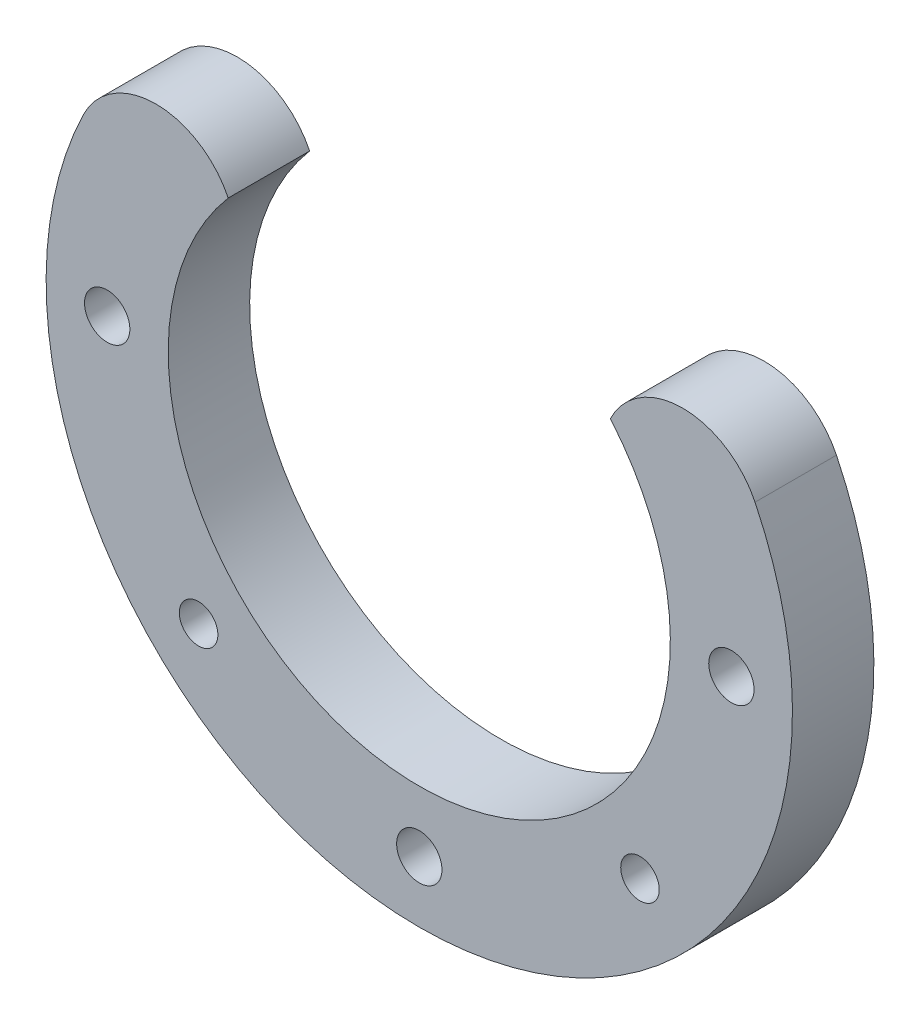
ISO-10303-21;
HEADER;
FILE_DESCRIPTION(('STEP AP214'),'2;1');
FILE_NAME('part.step','',(''),(''),'','','');
FILE_SCHEMA(('AUTOMOTIVE_DESIGN { 1 0 10303 214 1 1 1 1 }'));
ENDSEC;
DATA;
#1=APPLICATION_CONTEXT('core data for automotive mechanical design processes');
#2=APPLICATION_PROTOCOL_DEFINITION('international standard','automotive_design',2000,#1);
#3=PRODUCT_CONTEXT('',#1,'mechanical');
#4=PRODUCT('Part','Part','',(#3));
#5=PRODUCT_RELATED_PRODUCT_CATEGORY('part','',(#4));
#6=PRODUCT_DEFINITION_FORMATION('','',#4);
#7=PRODUCT_DEFINITION_CONTEXT('part definition',#1,'design');
#8=PRODUCT_DEFINITION('design','',#6,#7);
#9=PRODUCT_DEFINITION_SHAPE('','',#8);
#10=(LENGTH_UNIT() NAMED_UNIT(*) SI_UNIT(.MILLI.,.METRE.));
#11=(NAMED_UNIT(*) PLANE_ANGLE_UNIT() SI_UNIT($,.RADIAN.));
#12=(NAMED_UNIT(*) SI_UNIT($,.STERADIAN.) SOLID_ANGLE_UNIT());
#13=UNCERTAINTY_MEASURE_WITH_UNIT(LENGTH_MEASURE(1.E-05),#10,'distance_accuracy_value','');
#14=(GEOMETRIC_REPRESENTATION_CONTEXT(3) GLOBAL_UNCERTAINTY_ASSIGNED_CONTEXT((#13)) GLOBAL_UNIT_ASSIGNED_CONTEXT((#10,
#11,#12)) REPRESENTATION_CONTEXT('',''));
#15=CARTESIAN_POINT('',(0.,0.,0.));
#16=DIRECTION('',(0.,0.,1.));
#17=DIRECTION('',(1.,0.,0.));
#18=AXIS2_PLACEMENT_3D('',#15,#16,#17);
#19=CARTESIAN_POINT('',(-9.70595347591149,4.70711766278057,6.));
#20=DIRECTION('',(0.,0.,-1.));
#21=DIRECTION('',(-1.,0.,0.));
#22=AXIS2_PLACEMENT_3D('',#19,#20,#21);
#23=PLANE('',#22);
#24=CARTESIAN_POINT('',(23.,-2.40912212380176E-13,6.));
#25=DIRECTION('',(0.,0.,-1.));
#26=DIRECTION('',(-1.,0.,0.));
#27=AXIS2_PLACEMENT_3D('',#24,#25,#26);
#28=CIRCLE('',#27,1.67);
#29=CARTESIAN_POINT('',(21.33,-2.40912212380176E-13,6.));
#30=VERTEX_POINT('',#29);
#31=EDGE_CURVE('E117',#30,#30,#28,.F.);
#32=ORIENTED_EDGE('',*,*,#31,.F.);
#33=EDGE_LOOP('',(#32));
#34=FACE_BOUND('',#33,.T.);
#35=CARTESIAN_POINT('',(-16.2634559672906,-16.2634559672906,6.));
#36=DIRECTION('',(0.,0.,-1.));
#37=DIRECTION('',(-1.,0.,0.));
#38=AXIS2_PLACEMENT_3D('',#35,#36,#37);
#39=CIRCLE('',#38,1.42);
#40=CARTESIAN_POINT('',(-17.6834559672906,-16.2634559672906,6.));
#41=VERTEX_POINT('',#40);
#42=EDGE_CURVE('E129',#41,#41,#39,.F.);
#43=ORIENTED_EDGE('',*,*,#42,.F.);
#44=EDGE_LOOP('',(#43));
#45=FACE_BOUND('',#44,.T.);
#46=CARTESIAN_POINT('',(-19.411906951823,9.41423532556113,6.));
#47=DIRECTION('',(0.,0.,1.));
#48=DIRECTION('',(-1.,0.,0.));
#49=AXIS2_PLACEMENT_3D('',#46,#47,#48);
#50=CIRCLE('',#49,5.92571071225574);
#51=CARTESIAN_POINT('',(-14.0801278403287,12.,6.));
#52=VERTEX_POINT('',#51);
#53=CARTESIAN_POINT('',(-24.7436860633172,12.,6.));
#54=VERTEX_POINT('',#53);
#55=EDGE_CURVE('E88',#52,#54,#50,.T.);
#56=ORIENTED_EDGE('',*,*,#55,.T.);
#57=CARTESIAN_POINT('',(0.,0.,6.));
#58=DIRECTION('',(0.,0.,1.));
#59=DIRECTION('',(1.,0.,0.));
#60=AXIS2_PLACEMENT_3D('',#57,#58,#59);
#61=CIRCLE('',#60,27.5);
#62=CARTESIAN_POINT('',(24.7436860633172,12.,6.));
#63=VERTEX_POINT('',#62);
#64=EDGE_CURVE('E83',#54,#63,#61,.T.);
#65=ORIENTED_EDGE('',*,*,#64,.T.);
#66=CARTESIAN_POINT('',(19.411906951823,9.41423532556113,6.));
#67=DIRECTION('',(0.,0.,1.));
#68=DIRECTION('',(1.,0.,0.));
#69=AXIS2_PLACEMENT_3D('',#66,#67,#68);
#70=CIRCLE('',#69,5.92571071225574);
#71=CARTESIAN_POINT('',(14.0801278403287,12.,6.));
#72=VERTEX_POINT('',#71);
#73=EDGE_CURVE('E86',#63,#72,#70,.T.);
#74=ORIENTED_EDGE('',*,*,#73,.T.);
#75=CARTESIAN_POINT('',(0.,0.,6.));
#76=DIRECTION('',(0.,0.,-1.));
#77=DIRECTION('',(1.,0.,0.));
#78=AXIS2_PLACEMENT_3D('',#75,#76,#77);
#79=CIRCLE('',#78,18.5);
#80=EDGE_CURVE('E53',#72,#52,#79,.T.);
#81=ORIENTED_EDGE('',*,*,#80,.T.);
#82=EDGE_LOOP('',(#56,#65,#74,#81));
#83=FACE_BOUND('',#82,.T.);
#84=CARTESIAN_POINT('',(0.,-23.,6.));
#85=DIRECTION('',(0.,0.,-1.));
#86=DIRECTION('',(-1.,0.,0.));
#87=AXIS2_PLACEMENT_3D('',#84,#85,#86);
#88=CIRCLE('',#87,1.67);
#89=CARTESIAN_POINT('',(-1.67,-23.,6.));
#90=VERTEX_POINT('',#89);
#91=EDGE_CURVE('E104',#90,#90,#88,.F.);
#92=ORIENTED_EDGE('',*,*,#91,.F.);
#93=EDGE_LOOP('',(#92));
#94=FACE_BOUND('',#93,.T.);
#95=CARTESIAN_POINT('',(-23.,0.,6.));
#96=DIRECTION('',(0.,0.,-1.));
#97=DIRECTION('',(-1.,0.,0.));
#98=AXIS2_PLACEMENT_3D('',#95,#96,#97);
#99=CIRCLE('',#98,1.67);
#100=CARTESIAN_POINT('',(-24.67,0.,6.));
#101=VERTEX_POINT('',#100);
#102=EDGE_CURVE('E110',#101,#101,#99,.F.);
#103=ORIENTED_EDGE('',*,*,#102,.F.);
#104=EDGE_LOOP('',(#103));
#105=FACE_BOUND('',#104,.T.);
#106=CARTESIAN_POINT('',(16.2634559672906,-16.2634559672906,6.));
#107=DIRECTION('',(0.,0.,-1.));
#108=DIRECTION('',(-1.,0.,0.));
#109=AXIS2_PLACEMENT_3D('',#106,#107,#108);
#110=CIRCLE('',#109,1.42);
#111=CARTESIAN_POINT('',(14.8434559672906,-16.2634559672906,6.));
#112=VERTEX_POINT('',#111);
#113=EDGE_CURVE('E118',#112,#112,#110,.F.);
#114=ORIENTED_EDGE('',*,*,#113,.F.);
#115=EDGE_LOOP('',(#114));
#116=FACE_BOUND('',#115,.T.);
#117=ADVANCED_FACE('F34',(#34,#45,#83,#94,#105,#116),#23,.F.);
#118=CARTESIAN_POINT('',(-9.70595347591149,4.70711766278057,0.));
#119=DIRECTION('',(0.,0.,-1.));
#120=DIRECTION('',(-1.,0.,0.));
#121=AXIS2_PLACEMENT_3D('',#118,#119,#120);
#122=PLANE('',#121);
#123=CARTESIAN_POINT('',(23.,-2.40912212380176E-13,0.));
#124=DIRECTION('',(0.,0.,-1.));
#125=DIRECTION('',(-1.,0.,0.));
#126=AXIS2_PLACEMENT_3D('',#123,#124,#125);
#127=CIRCLE('',#126,1.67);
#128=CARTESIAN_POINT('',(21.33,-2.40912212380176E-13,0.));
#129=VERTEX_POINT('',#128);
#130=EDGE_CURVE('E121',#129,#129,#127,.F.);
#131=ORIENTED_EDGE('',*,*,#130,.T.);
#132=EDGE_LOOP('',(#131));
#133=FACE_BOUND('',#132,.T.);
#134=CARTESIAN_POINT('',(-16.2634559672906,-16.2634559672906,0.));
#135=DIRECTION('',(0.,0.,-1.));
#136=DIRECTION('',(-1.,0.,0.));
#137=AXIS2_PLACEMENT_3D('',#134,#135,#136);
#138=CIRCLE('',#137,1.42);
#139=CARTESIAN_POINT('',(-17.6834559672906,-16.2634559672906,0.));
#140=VERTEX_POINT('',#139);
#141=EDGE_CURVE('E113',#140,#140,#138,.F.);
#142=ORIENTED_EDGE('',*,*,#141,.T.);
#143=EDGE_LOOP('',(#142));
#144=FACE_BOUND('',#143,.T.);
#145=CARTESIAN_POINT('',(-19.411906951823,9.41423532556113,0.));
#146=DIRECTION('',(0.,0.,1.));
#147=DIRECTION('',(-1.,0.,0.));
#148=AXIS2_PLACEMENT_3D('',#145,#146,#147);
#149=CIRCLE('',#148,5.92571071225574);
#150=CARTESIAN_POINT('',(-14.0801278403287,12.,0.));
#151=VERTEX_POINT('',#150);
#152=CARTESIAN_POINT('',(-24.7436860633172,12.,0.));
#153=VERTEX_POINT('',#152);
#154=EDGE_CURVE('E101',#151,#153,#149,.T.);
#155=ORIENTED_EDGE('',*,*,#154,.F.);
#156=CARTESIAN_POINT('',(0.,0.,0.));
#157=DIRECTION('',(0.,0.,-1.));
#158=DIRECTION('',(1.,0.,0.));
#159=AXIS2_PLACEMENT_3D('',#156,#157,#158);
#160=CIRCLE('',#159,18.5);
#161=CARTESIAN_POINT('',(14.0801278403287,12.,0.));
#162=VERTEX_POINT('',#161);
#163=EDGE_CURVE('E76',#162,#151,#160,.T.);
#164=ORIENTED_EDGE('',*,*,#163,.F.);
#165=CARTESIAN_POINT('',(19.411906951823,9.41423532556113,0.));
#166=DIRECTION('',(0.,0.,1.));
#167=DIRECTION('',(1.,0.,0.));
#168=AXIS2_PLACEMENT_3D('',#165,#166,#167);
#169=CIRCLE('',#168,5.92571071225574);
#170=CARTESIAN_POINT('',(24.7436860633172,12.,0.));
#171=VERTEX_POINT('',#170);
#172=EDGE_CURVE('E70',#171,#162,#169,.T.);
#173=ORIENTED_EDGE('',*,*,#172,.F.);
#174=CARTESIAN_POINT('',(0.,0.,0.));
#175=DIRECTION('',(0.,0.,1.));
#176=DIRECTION('',(1.,0.,0.));
#177=AXIS2_PLACEMENT_3D('',#174,#175,#176);
#178=CIRCLE('',#177,27.5);
#179=EDGE_CURVE('E92',#153,#171,#178,.T.);
#180=ORIENTED_EDGE('',*,*,#179,.F.);
#181=EDGE_LOOP('',(#155,#164,#173,#180));
#182=FACE_BOUND('',#181,.T.);
#183=CARTESIAN_POINT('',(0.,-23.,0.));
#184=DIRECTION('',(0.,0.,-1.));
#185=DIRECTION('',(-1.,0.,0.));
#186=AXIS2_PLACEMENT_3D('',#183,#184,#185);
#187=CIRCLE('',#186,1.67);
#188=CARTESIAN_POINT('',(-1.67,-23.,0.));
#189=VERTEX_POINT('',#188);
#190=EDGE_CURVE('E38',#189,#189,#187,.F.);
#191=ORIENTED_EDGE('',*,*,#190,.T.);
#192=EDGE_LOOP('',(#191));
#193=FACE_BOUND('',#192,.T.);
#194=CARTESIAN_POINT('',(-23.,0.,0.));
#195=DIRECTION('',(0.,0.,-1.));
#196=DIRECTION('',(-1.,0.,0.));
#197=AXIS2_PLACEMENT_3D('',#194,#195,#196);
#198=CIRCLE('',#197,1.67);
#199=CARTESIAN_POINT('',(-24.67,0.,0.));
#200=VERTEX_POINT('',#199);
#201=EDGE_CURVE('E114',#200,#200,#198,.F.);
#202=ORIENTED_EDGE('',*,*,#201,.T.);
#203=EDGE_LOOP('',(#202));
#204=FACE_BOUND('',#203,.T.);
#205=CARTESIAN_POINT('',(16.2634559672906,-16.2634559672906,0.));
#206=DIRECTION('',(0.,0.,-1.));
#207=DIRECTION('',(-1.,0.,0.));
#208=AXIS2_PLACEMENT_3D('',#205,#206,#207);
#209=CIRCLE('',#208,1.42);
#210=CARTESIAN_POINT('',(14.8434559672906,-16.2634559672906,0.));
#211=VERTEX_POINT('',#210);
#212=EDGE_CURVE('E122',#211,#211,#209,.F.);
#213=ORIENTED_EDGE('',*,*,#212,.T.);
#214=EDGE_LOOP('',(#213));
#215=FACE_BOUND('',#214,.T.);
#216=ADVANCED_FACE('F139',(#133,#144,#182,#193,#204,#215),#122,.T.);
#217=CARTESIAN_POINT('',(-19.411906951823,9.41423532556113,6.));
#218=DIRECTION('',(0.,0.,-1.));
#219=DIRECTION('',(-1.,0.,0.));
#220=AXIS2_PLACEMENT_3D('',#217,#218,#219);
#221=CYLINDRICAL_SURFACE('',#220,5.92571071225574);
#222=ORIENTED_EDGE('',*,*,#154,.T.);
#223=DIRECTION('',(0.,0.,-1.));
#224=VECTOR('',#223,1.);
#225=CARTESIAN_POINT('',(-24.7436860633172,12.,6.));
#226=LINE('',#225,#224);
#227=EDGE_CURVE('E12',#54,#153,#226,.T.);
#228=ORIENTED_EDGE('',*,*,#227,.F.);
#229=ORIENTED_EDGE('',*,*,#55,.F.);
#230=DIRECTION('',(0.,0.,-1.));
#231=VECTOR('',#230,1.);
#232=CARTESIAN_POINT('',(-14.0801278403287,12.,6.));
#233=LINE('',#232,#231);
#234=EDGE_CURVE('E97',#52,#151,#233,.T.);
#235=ORIENTED_EDGE('',*,*,#234,.T.);
#236=EDGE_LOOP('',(#222,#228,#229,#235));
#237=FACE_BOUND('',#236,.T.);
#238=ADVANCED_FACE('F162',(#237),#221,.T.);
#239=CARTESIAN_POINT('',(0.,0.,6.));
#240=DIRECTION('',(0.,0.,-1.));
#241=DIRECTION('',(-1.,0.,0.));
#242=AXIS2_PLACEMENT_3D('',#239,#240,#241);
#243=CYLINDRICAL_SURFACE('',#242,27.5);
#244=ORIENTED_EDGE('',*,*,#179,.T.);
#245=DIRECTION('',(0.,0.,-1.));
#246=VECTOR('',#245,1.);
#247=CARTESIAN_POINT('',(24.7436860633172,12.,6.));
#248=LINE('',#247,#246);
#249=EDGE_CURVE('E44',#63,#171,#248,.T.);
#250=ORIENTED_EDGE('',*,*,#249,.F.);
#251=ORIENTED_EDGE('',*,*,#64,.F.);
#252=ORIENTED_EDGE('',*,*,#227,.T.);
#253=EDGE_LOOP('',(#244,#250,#251,#252));
#254=FACE_BOUND('',#253,.T.);
#255=ADVANCED_FACE('F91',(#254),#243,.T.);
#256=CARTESIAN_POINT('',(19.411906951823,9.41423532556113,6.));
#257=DIRECTION('',(0.,0.,-1.));
#258=DIRECTION('',(-1.,0.,0.));
#259=AXIS2_PLACEMENT_3D('',#256,#257,#258);
#260=CYLINDRICAL_SURFACE('',#259,5.92571071225574);
#261=ORIENTED_EDGE('',*,*,#172,.T.);
#262=DIRECTION('',(0.,0.,-1.));
#263=VECTOR('',#262,1.);
#264=CARTESIAN_POINT('',(14.0801278403287,12.,6.));
#265=LINE('',#264,#263);
#266=EDGE_CURVE('E93',#72,#162,#265,.T.);
#267=ORIENTED_EDGE('',*,*,#266,.F.);
#268=ORIENTED_EDGE('',*,*,#73,.F.);
#269=ORIENTED_EDGE('',*,*,#249,.T.);
#270=EDGE_LOOP('',(#261,#267,#268,#269));
#271=FACE_BOUND('',#270,.T.);
#272=ADVANCED_FACE('F95',(#271),#260,.T.);
#273=CARTESIAN_POINT('',(0.,0.,6.));
#274=DIRECTION('',(0.,0.,-1.));
#275=DIRECTION('',(-1.,0.,0.));
#276=AXIS2_PLACEMENT_3D('',#273,#274,#275);
#277=CYLINDRICAL_SURFACE('',#276,18.5);
#278=ORIENTED_EDGE('',*,*,#163,.T.);
#279=ORIENTED_EDGE('',*,*,#234,.F.);
#280=ORIENTED_EDGE('',*,*,#80,.F.);
#281=ORIENTED_EDGE('',*,*,#266,.T.);
#282=EDGE_LOOP('',(#278,#279,#280,#281));
#283=FACE_BOUND('',#282,.T.);
#284=ADVANCED_FACE('F145',(#283),#277,.F.);
#285=CARTESIAN_POINT('',(0.,-23.,6.));
#286=DIRECTION('',(0.,0.,-1.));
#287=DIRECTION('',(-1.,0.,0.));
#288=AXIS2_PLACEMENT_3D('',#285,#286,#287);
#289=CYLINDRICAL_SURFACE('',#288,1.67);
#290=ORIENTED_EDGE('',*,*,#91,.T.);
#291=EDGE_LOOP('',(#290));
#292=FACE_BOUND('',#291,.T.);
#293=ORIENTED_EDGE('',*,*,#190,.F.);
#294=EDGE_LOOP('',(#293));
#295=FACE_BOUND('',#294,.T.);
#296=ADVANCED_FACE('F142',(#292,#295),#289,.F.);
#297=CARTESIAN_POINT('',(-16.2634559672906,-16.2634559672906,6.));
#298=DIRECTION('',(0.,0.,-1.));
#299=DIRECTION('',(-1.,0.,0.));
#300=AXIS2_PLACEMENT_3D('',#297,#298,#299);
#301=CYLINDRICAL_SURFACE('',#300,1.42);
#302=ORIENTED_EDGE('',*,*,#42,.T.);
#303=EDGE_LOOP('',(#302));
#304=FACE_BOUND('',#303,.T.);
#305=ORIENTED_EDGE('',*,*,#141,.F.);
#306=EDGE_LOOP('',(#305));
#307=FACE_BOUND('',#306,.T.);
#308=ADVANCED_FACE('F144',(#304,#307),#301,.F.);
#309=CARTESIAN_POINT('',(-23.,0.,6.));
#310=DIRECTION('',(0.,0.,-1.));
#311=DIRECTION('',(-1.,0.,0.));
#312=AXIS2_PLACEMENT_3D('',#309,#310,#311);
#313=CYLINDRICAL_SURFACE('',#312,1.67);
#314=ORIENTED_EDGE('',*,*,#102,.T.);
#315=EDGE_LOOP('',(#314));
#316=FACE_BOUND('',#315,.T.);
#317=ORIENTED_EDGE('',*,*,#201,.F.);
#318=EDGE_LOOP('',(#317));
#319=FACE_BOUND('',#318,.T.);
#320=ADVANCED_FACE('F151',(#316,#319),#313,.F.);
#321=CARTESIAN_POINT('',(23.,-2.40912212380176E-13,6.));
#322=DIRECTION('',(0.,0.,-1.));
#323=DIRECTION('',(-1.,0.,0.));
#324=AXIS2_PLACEMENT_3D('',#321,#322,#323);
#325=CYLINDRICAL_SURFACE('',#324,1.67);
#326=ORIENTED_EDGE('',*,*,#31,.T.);
#327=EDGE_LOOP('',(#326));
#328=FACE_BOUND('',#327,.T.);
#329=ORIENTED_EDGE('',*,*,#130,.F.);
#330=EDGE_LOOP('',(#329));
#331=FACE_BOUND('',#330,.T.);
#332=ADVANCED_FACE('F175',(#328,#331),#325,.F.);
#333=CARTESIAN_POINT('',(16.2634559672906,-16.2634559672906,6.));
#334=DIRECTION('',(0.,0.,-1.));
#335=DIRECTION('',(-1.,0.,0.));
#336=AXIS2_PLACEMENT_3D('',#333,#334,#335);
#337=CYLINDRICAL_SURFACE('',#336,1.42);
#338=ORIENTED_EDGE('',*,*,#113,.T.);
#339=EDGE_LOOP('',(#338));
#340=FACE_BOUND('',#339,.T.);
#341=ORIENTED_EDGE('',*,*,#212,.F.);
#342=EDGE_LOOP('',(#341));
#343=FACE_BOUND('',#342,.T.);
#344=ADVANCED_FACE('F36',(#340,#343),#337,.F.);
#345=CLOSED_SHELL('',(#117,#216,#238,#255,#272,#284,#296,#308,#320,#332,#344));
#346=MANIFOLD_SOLID_BREP('B2',#345);
#347=ADVANCED_BREP_SHAPE_REPRESENTATION('',(#18,#346),#14);
#348=SHAPE_DEFINITION_REPRESENTATION(#9,#347);
ENDSEC;
END-ISO-10303-21;
